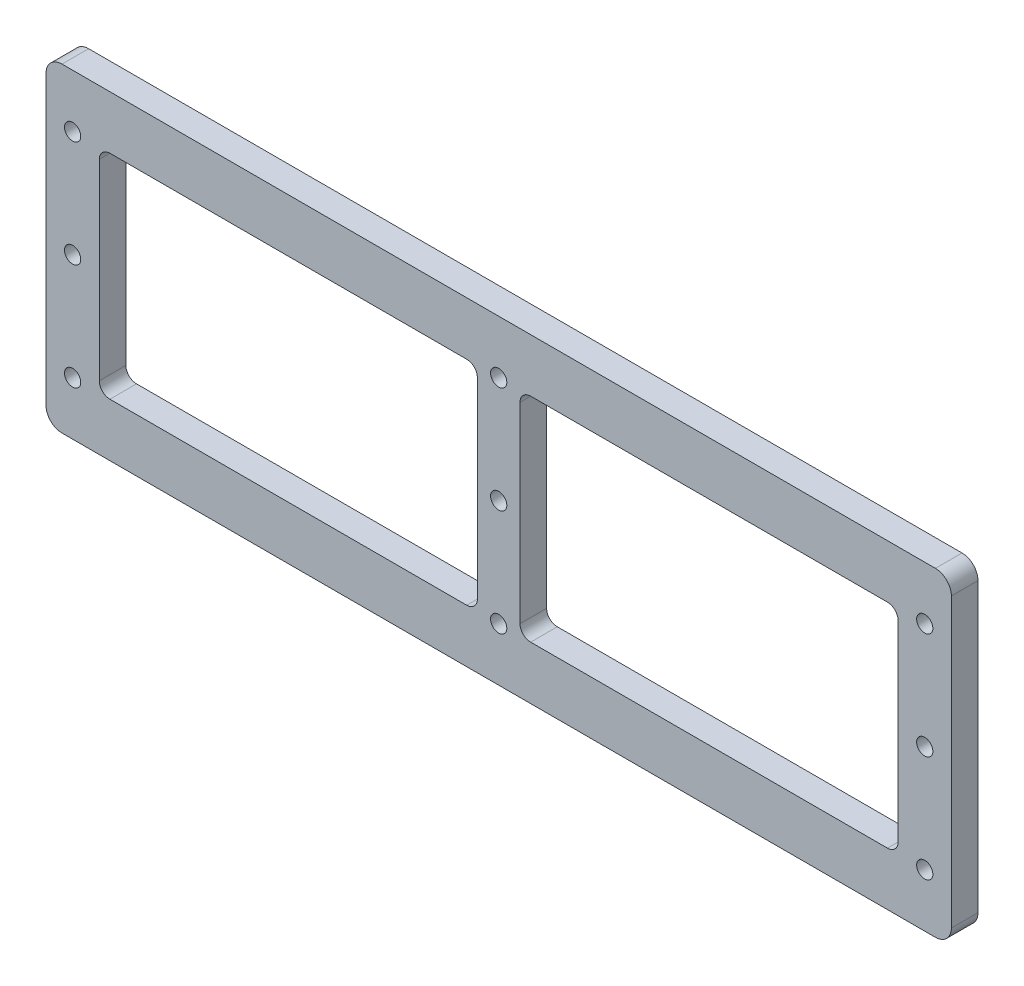
ISO-10303-21;
HEADER;
FILE_DESCRIPTION(('STEP AP214'),'2;1');
FILE_NAME('part.step','',(''),(''),'','','');
FILE_SCHEMA(('AUTOMOTIVE_DESIGN { 1 0 10303 214 1 1 1 1 }'));
ENDSEC;
DATA;
#1=APPLICATION_CONTEXT('core data for automotive mechanical design processes');
#2=APPLICATION_PROTOCOL_DEFINITION('international standard','automotive_design',2000,#1);
#3=PRODUCT_CONTEXT('',#1,'mechanical');
#4=PRODUCT('Part','Part','',(#3));
#5=PRODUCT_RELATED_PRODUCT_CATEGORY('part','',(#4));
#6=PRODUCT_DEFINITION_FORMATION('','',#4);
#7=PRODUCT_DEFINITION_CONTEXT('part definition',#1,'design');
#8=PRODUCT_DEFINITION('design','',#6,#7);
#9=PRODUCT_DEFINITION_SHAPE('','',#8);
#10=(LENGTH_UNIT() NAMED_UNIT(*) SI_UNIT(.MILLI.,.METRE.));
#11=(NAMED_UNIT(*) PLANE_ANGLE_UNIT() SI_UNIT($,.RADIAN.));
#12=(NAMED_UNIT(*) SI_UNIT($,.STERADIAN.) SOLID_ANGLE_UNIT());
#13=UNCERTAINTY_MEASURE_WITH_UNIT(LENGTH_MEASURE(1.E-05),#10,'distance_accuracy_value','');
#14=(GEOMETRIC_REPRESENTATION_CONTEXT(3) GLOBAL_UNCERTAINTY_ASSIGNED_CONTEXT((#13)) GLOBAL_UNIT_ASSIGNED_CONTEXT((#10,
#11,#12)) REPRESENTATION_CONTEXT('',''));
#15=CARTESIAN_POINT('',(0.,0.,0.));
#16=DIRECTION('',(0.,0.,1.));
#17=DIRECTION('',(1.,0.,0.));
#18=AXIS2_PLACEMENT_3D('',#15,#16,#17);
#19=CARTESIAN_POINT('',(-75.,-20.,0.));
#20=DIRECTION('',(0.,-1.,0.));
#21=DIRECTION('',(1.,0.,0.));
#22=AXIS2_PLACEMENT_3D('',#19,#20,#21);
#23=PLANE('',#22);
#24=DIRECTION('',(1.,0.,0.));
#25=VECTOR('',#24,1.);
#26=CARTESIAN_POINT('',(-75.,-20.,5.));
#27=LINE('',#26,#25);
#28=CARTESIAN_POINT('',(-73.,-20.,5.));
#29=VERTEX_POINT('',#28);
#30=CARTESIAN_POINT('',(-5.99999999999999,-20.,5.));
#31=VERTEX_POINT('',#30);
#32=EDGE_CURVE('E333',#29,#31,#27,.T.);
#33=ORIENTED_EDGE('',*,*,#32,.T.);
#34=DIRECTION('',(0.,0.,1.));
#35=VECTOR('',#34,1.);
#36=CARTESIAN_POINT('',(-5.99999999999999,-20.,0.));
#37=LINE('',#36,#35);
#38=CARTESIAN_POINT('',(-5.99999999999999,-20.,0.));
#39=VERTEX_POINT('',#38);
#40=EDGE_CURVE('E273',#31,#39,#37,.F.);
#41=ORIENTED_EDGE('',*,*,#40,.T.);
#42=DIRECTION('',(1.,0.,0.));
#43=VECTOR('',#42,1.);
#44=CARTESIAN_POINT('',(-75.,-20.,0.));
#45=LINE('',#44,#43);
#46=CARTESIAN_POINT('',(-73.,-20.,0.));
#47=VERTEX_POINT('',#46);
#48=EDGE_CURVE('E344',#47,#39,#45,.T.);
#49=ORIENTED_EDGE('',*,*,#48,.F.);
#50=DIRECTION('',(0.,0.,1.));
#51=VECTOR('',#50,1.);
#52=CARTESIAN_POINT('',(-73.,-20.,5.));
#53=LINE('',#52,#51);
#54=EDGE_CURVE('E270',#47,#29,#53,.T.);
#55=ORIENTED_EDGE('',*,*,#54,.T.);
#56=EDGE_LOOP('',(#33,#41,#49,#55));
#57=FACE_BOUND('',#56,.T.);
#58=ADVANCED_FACE('F35',(#57),#23,.F.);
#59=CARTESIAN_POINT('',(-75.,20.,0.));
#60=DIRECTION('',(0.,1.,0.));
#61=DIRECTION('',(-1.,0.,0.));
#62=AXIS2_PLACEMENT_3D('',#59,#60,#61);
#63=PLANE('',#62);
#64=DIRECTION('',(-1.,0.,0.));
#65=VECTOR('',#64,1.);
#66=CARTESIAN_POINT('',(-75.,20.,0.));
#67=LINE('',#66,#65);
#68=CARTESIAN_POINT('',(-6.00000000000001,20.,0.));
#69=VERTEX_POINT('',#68);
#70=CARTESIAN_POINT('',(-73.,20.,0.));
#71=VERTEX_POINT('',#70);
#72=EDGE_CURVE('E445',#69,#71,#67,.T.);
#73=ORIENTED_EDGE('',*,*,#72,.F.);
#74=DIRECTION('',(0.,0.,1.));
#75=VECTOR('',#74,1.);
#76=CARTESIAN_POINT('',(-6.00000000000001,20.,0.));
#77=LINE('',#76,#75);
#78=CARTESIAN_POINT('',(-6.00000000000001,20.,5.));
#79=VERTEX_POINT('',#78);
#80=EDGE_CURVE('E262',#69,#79,#77,.T.);
#81=ORIENTED_EDGE('',*,*,#80,.T.);
#82=DIRECTION('',(-1.,0.,0.));
#83=VECTOR('',#82,1.);
#84=CARTESIAN_POINT('',(-75.,20.,5.));
#85=LINE('',#84,#83);
#86=CARTESIAN_POINT('',(-73.,20.,5.));
#87=VERTEX_POINT('',#86);
#88=EDGE_CURVE('E359',#79,#87,#85,.T.);
#89=ORIENTED_EDGE('',*,*,#88,.T.);
#90=DIRECTION('',(0.,0.,1.));
#91=VECTOR('',#90,1.);
#92=CARTESIAN_POINT('',(-73.,20.,0.));
#93=LINE('',#92,#91);
#94=EDGE_CURVE('E260',#87,#71,#93,.F.);
#95=ORIENTED_EDGE('',*,*,#94,.T.);
#96=EDGE_LOOP('',(#73,#81,#89,#95));
#97=FACE_BOUND('',#96,.T.);
#98=ADVANCED_FACE('F408',(#97),#63,.F.);
#99=CARTESIAN_POINT('',(85.,-30.,5.));
#100=DIRECTION('',(-1.,0.,0.));
#101=DIRECTION('',(0.,0.,1.));
#102=AXIS2_PLACEMENT_3D('',#99,#100,#101);
#103=PLANE('',#102);
#104=DIRECTION('',(0.,1.,0.));
#105=VECTOR('',#104,1.);
#106=CARTESIAN_POINT('',(85.,-30.,5.));
#107=LINE('',#106,#105);
#108=CARTESIAN_POINT('',(85.,-27.,5.));
#109=VERTEX_POINT('',#108);
#110=CARTESIAN_POINT('',(85.,27.,5.));
#111=VERTEX_POINT('',#110);
#112=EDGE_CURVE('E227',#109,#111,#107,.T.);
#113=ORIENTED_EDGE('',*,*,#112,.F.);
#114=DIRECTION('',(0.,0.,-1.));
#115=VECTOR('',#114,1.);
#116=CARTESIAN_POINT('',(85.,-27.,5.));
#117=LINE('',#116,#115);
#118=CARTESIAN_POINT('',(85.,-27.,0.));
#119=VERTEX_POINT('',#118);
#120=EDGE_CURVE('E257',#109,#119,#117,.T.);
#121=ORIENTED_EDGE('',*,*,#120,.T.);
#122=DIRECTION('',(0.,1.,0.));
#123=VECTOR('',#122,1.);
#124=CARTESIAN_POINT('',(85.,-30.,0.));
#125=LINE('',#124,#123);
#126=CARTESIAN_POINT('',(85.,27.,0.));
#127=VERTEX_POINT('',#126);
#128=EDGE_CURVE('E229',#119,#127,#125,.T.);
#129=ORIENTED_EDGE('',*,*,#128,.T.);
#130=DIRECTION('',(0.,0.,-1.));
#131=VECTOR('',#130,1.);
#132=CARTESIAN_POINT('',(85.,27.,5.));
#133=LINE('',#132,#131);
#134=EDGE_CURVE('E255',#127,#111,#133,.F.);
#135=ORIENTED_EDGE('',*,*,#134,.T.);
#136=EDGE_LOOP('',(#113,#121,#129,#135));
#137=FACE_BOUND('',#136,.T.);
#138=ADVANCED_FACE('F384',(#137),#103,.F.);
#139=CARTESIAN_POINT('',(-85.,30.,5.));
#140=DIRECTION('',(0.,-1.,0.));
#141=DIRECTION('',(0.,0.,-1.));
#142=AXIS2_PLACEMENT_3D('',#139,#140,#141);
#143=PLANE('',#142);
#144=DIRECTION('',(-1.,0.,0.));
#145=VECTOR('',#144,1.);
#146=CARTESIAN_POINT('',(-85.,30.,0.));
#147=LINE('',#146,#145);
#148=CARTESIAN_POINT('',(82.,30.,0.));
#149=VERTEX_POINT('',#148);
#150=CARTESIAN_POINT('',(-82.,30.,0.));
#151=VERTEX_POINT('',#150);
#152=EDGE_CURVE('E224',#149,#151,#147,.T.);
#153=ORIENTED_EDGE('',*,*,#152,.T.);
#154=DIRECTION('',(0.,0.,-1.));
#155=VECTOR('',#154,1.);
#156=CARTESIAN_POINT('',(-82.,30.,5.));
#157=LINE('',#156,#155);
#158=CARTESIAN_POINT('',(-82.,30.,5.));
#159=VERTEX_POINT('',#158);
#160=EDGE_CURVE('E202',#151,#159,#157,.F.);
#161=ORIENTED_EDGE('',*,*,#160,.T.);
#162=DIRECTION('',(-1.,0.,0.));
#163=VECTOR('',#162,1.);
#164=CARTESIAN_POINT('',(-85.,30.,5.));
#165=LINE('',#164,#163);
#166=CARTESIAN_POINT('',(82.,30.,5.));
#167=VERTEX_POINT('',#166);
#168=EDGE_CURVE('E367',#167,#159,#165,.T.);
#169=ORIENTED_EDGE('',*,*,#168,.F.);
#170=DIRECTION('',(0.,0.,-1.));
#171=VECTOR('',#170,1.);
#172=CARTESIAN_POINT('',(82.,30.,5.));
#173=LINE('',#172,#171);
#174=EDGE_CURVE('E207',#167,#149,#173,.T.);
#175=ORIENTED_EDGE('',*,*,#174,.T.);
#176=EDGE_LOOP('',(#153,#161,#169,#175));
#177=FACE_BOUND('',#176,.T.);
#178=ADVANCED_FACE('F392',(#177),#143,.F.);
#179=CARTESIAN_POINT('',(-85.,-30.,5.));
#180=DIRECTION('',(1.,0.,0.));
#181=DIRECTION('',(0.,0.,-1.));
#182=AXIS2_PLACEMENT_3D('',#179,#180,#181);
#183=PLANE('',#182);
#184=DIRECTION('',(0.,-1.,0.));
#185=VECTOR('',#184,1.);
#186=CARTESIAN_POINT('',(-85.,-30.,5.));
#187=LINE('',#186,#185);
#188=CARTESIAN_POINT('',(-85.,27.,5.));
#189=VERTEX_POINT('',#188);
#190=CARTESIAN_POINT('',(-85.,-27.,5.));
#191=VERTEX_POINT('',#190);
#192=EDGE_CURVE('E217',#189,#191,#187,.T.);
#193=ORIENTED_EDGE('',*,*,#192,.F.);
#194=DIRECTION('',(0.,0.,-1.));
#195=VECTOR('',#194,1.);
#196=CARTESIAN_POINT('',(-85.,27.,5.));
#197=LINE('',#196,#195);
#198=CARTESIAN_POINT('',(-85.,27.,0.));
#199=VERTEX_POINT('',#198);
#200=EDGE_CURVE('E201',#189,#199,#197,.T.);
#201=ORIENTED_EDGE('',*,*,#200,.T.);
#202=DIRECTION('',(0.,-1.,0.));
#203=VECTOR('',#202,1.);
#204=CARTESIAN_POINT('',(-85.,-30.,0.));
#205=LINE('',#204,#203);
#206=CARTESIAN_POINT('',(-85.,-27.,0.));
#207=VERTEX_POINT('',#206);
#208=EDGE_CURVE('E214',#199,#207,#205,.T.);
#209=ORIENTED_EDGE('',*,*,#208,.T.);
#210=DIRECTION('',(0.,0.,-1.));
#211=VECTOR('',#210,1.);
#212=CARTESIAN_POINT('',(-85.,-27.,5.));
#213=LINE('',#212,#211);
#214=EDGE_CURVE('E219',#207,#191,#213,.F.);
#215=ORIENTED_EDGE('',*,*,#214,.T.);
#216=EDGE_LOOP('',(#193,#201,#209,#215));
#217=FACE_BOUND('',#216,.T.);
#218=ADVANCED_FACE('F213',(#217),#183,.F.);
#219=CARTESIAN_POINT('',(-85.,-30.,5.));
#220=DIRECTION('',(0.,1.,0.));
#221=DIRECTION('',(0.,0.,1.));
#222=AXIS2_PLACEMENT_3D('',#219,#220,#221);
#223=PLANE('',#222);
#224=DIRECTION('',(1.,0.,0.));
#225=VECTOR('',#224,1.);
#226=CARTESIAN_POINT('',(-85.,-30.,5.));
#227=LINE('',#226,#225);
#228=CARTESIAN_POINT('',(-82.,-30.,5.));
#229=VERTEX_POINT('',#228);
#230=CARTESIAN_POINT('',(82.,-30.,5.));
#231=VERTEX_POINT('',#230);
#232=EDGE_CURVE('E233',#229,#231,#227,.T.);
#233=ORIENTED_EDGE('',*,*,#232,.F.);
#234=DIRECTION('',(0.,0.,-1.));
#235=VECTOR('',#234,1.);
#236=CARTESIAN_POINT('',(-82.,-30.,5.));
#237=LINE('',#236,#235);
#238=CARTESIAN_POINT('',(-82.,-30.,0.));
#239=VERTEX_POINT('',#238);
#240=EDGE_CURVE('E252',#229,#239,#237,.T.);
#241=ORIENTED_EDGE('',*,*,#240,.T.);
#242=DIRECTION('',(1.,0.,0.));
#243=VECTOR('',#242,1.);
#244=CARTESIAN_POINT('',(-85.,-30.,0.));
#245=LINE('',#244,#243);
#246=CARTESIAN_POINT('',(82.,-30.,0.));
#247=VERTEX_POINT('',#246);
#248=EDGE_CURVE('E223',#239,#247,#245,.T.);
#249=ORIENTED_EDGE('',*,*,#248,.T.);
#250=DIRECTION('',(0.,0.,-1.));
#251=VECTOR('',#250,1.);
#252=CARTESIAN_POINT('',(82.,-30.,5.));
#253=LINE('',#252,#251);
#254=EDGE_CURVE('E250',#247,#231,#253,.F.);
#255=ORIENTED_EDGE('',*,*,#254,.T.);
#256=EDGE_LOOP('',(#233,#241,#249,#255));
#257=FACE_BOUND('',#256,.T.);
#258=ADVANCED_FACE('F395',(#257),#223,.F.);
#259=CARTESIAN_POINT('',(0.,0.,5.));
#260=DIRECTION('',(0.,0.,-1.));
#261=DIRECTION('',(-1.,0.,0.));
#262=AXIS2_PLACEMENT_3D('',#259,#260,#261);
#263=PLANE('',#262);
#264=CARTESIAN_POINT('',(-80.,0.,5.));
#265=DIRECTION('',(0.,0.,-1.));
#266=DIRECTION('',(-1.,0.,0.));
#267=AXIS2_PLACEMENT_3D('',#264,#265,#266);
#268=CIRCLE('',#267,1.525);
#269=CARTESIAN_POINT('',(-81.525,0.,5.));
#270=VERTEX_POINT('',#269);
#271=EDGE_CURVE('E700',#270,#270,#268,.F.);
#272=ORIENTED_EDGE('',*,*,#271,.F.);
#273=EDGE_LOOP('',(#272));
#274=FACE_BOUND('',#273,.T.);
#275=CARTESIAN_POINT('',(0.,-20.,5.));
#276=DIRECTION('',(0.,0.,-1.));
#277=DIRECTION('',(-1.,0.,0.));
#278=AXIS2_PLACEMENT_3D('',#275,#276,#277);
#279=CIRCLE('',#278,1.525);
#280=CARTESIAN_POINT('',(-1.525,-20.,5.));
#281=VERTEX_POINT('',#280);
#282=EDGE_CURVE('E701',#281,#281,#279,.F.);
#283=ORIENTED_EDGE('',*,*,#282,.F.);
#284=EDGE_LOOP('',(#283));
#285=FACE_BOUND('',#284,.T.);
#286=CARTESIAN_POINT('',(0.,20.,5.));
#287=DIRECTION('',(0.,0.,-1.));
#288=DIRECTION('',(-1.,0.,0.));
#289=AXIS2_PLACEMENT_3D('',#286,#287,#288);
#290=CIRCLE('',#289,1.525);
#291=CARTESIAN_POINT('',(-1.525,20.,5.));
#292=VERTEX_POINT('',#291);
#293=EDGE_CURVE('E707',#292,#292,#290,.F.);
#294=ORIENTED_EDGE('',*,*,#293,.F.);
#295=EDGE_LOOP('',(#294));
#296=FACE_BOUND('',#295,.T.);
#297=CARTESIAN_POINT('',(80.,20.,5.));
#298=DIRECTION('',(0.,0.,-1.));
#299=DIRECTION('',(-1.,0.,0.));
#300=AXIS2_PLACEMENT_3D('',#297,#298,#299);
#301=CIRCLE('',#300,1.525);
#302=CARTESIAN_POINT('',(78.475,20.,5.));
#303=VERTEX_POINT('',#302);
#304=EDGE_CURVE('E713',#303,#303,#301,.F.);
#305=ORIENTED_EDGE('',*,*,#304,.F.);
#306=EDGE_LOOP('',(#305));
#307=FACE_BOUND('',#306,.T.);
#308=CARTESIAN_POINT('',(80.,0.,5.));
#309=DIRECTION('',(0.,0.,-1.));
#310=DIRECTION('',(-1.,0.,0.));
#311=AXIS2_PLACEMENT_3D('',#308,#309,#310);
#312=CIRCLE('',#311,1.525);
#313=CARTESIAN_POINT('',(78.475,0.,5.));
#314=VERTEX_POINT('',#313);
#315=EDGE_CURVE('E670',#314,#314,#312,.F.);
#316=ORIENTED_EDGE('',*,*,#315,.F.);
#317=EDGE_LOOP('',(#316));
#318=FACE_BOUND('',#317,.T.);
#319=CARTESIAN_POINT('',(80.,-20.,5.));
#320=DIRECTION('',(0.,0.,-1.));
#321=DIRECTION('',(-1.,0.,0.));
#322=AXIS2_PLACEMENT_3D('',#319,#320,#321);
#323=CIRCLE('',#322,1.525);
#324=CARTESIAN_POINT('',(78.475,-20.,5.));
#325=VERTEX_POINT('',#324);
#326=EDGE_CURVE('E675',#325,#325,#323,.F.);
#327=ORIENTED_EDGE('',*,*,#326,.F.);
#328=EDGE_LOOP('',(#327));
#329=FACE_BOUND('',#328,.T.);
#330=CARTESIAN_POINT('',(0.,0.,5.));
#331=DIRECTION('',(0.,0.,-1.));
#332=DIRECTION('',(-1.,0.,0.));
#333=AXIS2_PLACEMENT_3D('',#330,#331,#332);
#334=CIRCLE('',#333,1.525);
#335=CARTESIAN_POINT('',(-1.525,0.,5.));
#336=VERTEX_POINT('',#335);
#337=EDGE_CURVE('E684',#336,#336,#334,.F.);
#338=ORIENTED_EDGE('',*,*,#337,.F.);
#339=EDGE_LOOP('',(#338));
#340=FACE_BOUND('',#339,.T.);
#341=CARTESIAN_POINT('',(-80.,-20.,5.));
#342=DIRECTION('',(0.,0.,-1.));
#343=DIRECTION('',(-1.,0.,0.));
#344=AXIS2_PLACEMENT_3D('',#341,#342,#343);
#345=CIRCLE('',#344,1.525);
#346=CARTESIAN_POINT('',(-81.525,-20.,5.));
#347=VERTEX_POINT('',#346);
#348=EDGE_CURVE('E689',#347,#347,#345,.F.);
#349=ORIENTED_EDGE('',*,*,#348,.F.);
#350=EDGE_LOOP('',(#349));
#351=FACE_BOUND('',#350,.T.);
#352=CARTESIAN_POINT('',(-80.,20.,5.));
#353=DIRECTION('',(0.,0.,-1.));
#354=DIRECTION('',(-1.,0.,0.));
#355=AXIS2_PLACEMENT_3D('',#352,#353,#354);
#356=CIRCLE('',#355,1.525);
#357=CARTESIAN_POINT('',(-81.525,20.,5.));
#358=VERTEX_POINT('',#357);
#359=EDGE_CURVE('E469',#358,#358,#356,.F.);
#360=ORIENTED_EDGE('',*,*,#359,.F.);
#361=EDGE_LOOP('',(#360));
#362=FACE_BOUND('',#361,.T.);
#363=CARTESIAN_POINT('',(6.00000000000001,-20.,5.));
#364=VERTEX_POINT('',#363);
#365=CARTESIAN_POINT('',(73.,-20.,5.));
#366=VERTEX_POINT('',#365);
#367=EDGE_CURVE('E338',#364,#366,#27,.T.);
#368=ORIENTED_EDGE('',*,*,#367,.F.);
#369=CARTESIAN_POINT('',(6.00000000000001,-18.,5.));
#370=DIRECTION('',(0.,0.,-1.));
#371=DIRECTION('',(-1.,0.,0.));
#372=AXIS2_PLACEMENT_3D('',#369,#370,#371);
#373=CIRCLE('',#372,2.);
#374=CARTESIAN_POINT('',(4.,-18.,5.));
#375=VERTEX_POINT('',#374);
#376=EDGE_CURVE('E319',#364,#375,#373,.T.);
#377=ORIENTED_EDGE('',*,*,#376,.T.);
#378=DIRECTION('',(0.,1.,0.));
#379=VECTOR('',#378,1.);
#380=CARTESIAN_POINT('',(4.,-20.,5.));
#381=LINE('',#380,#379);
#382=CARTESIAN_POINT('',(4.,18.,5.));
#383=VERTEX_POINT('',#382);
#384=EDGE_CURVE('E465',#375,#383,#381,.T.);
#385=ORIENTED_EDGE('',*,*,#384,.T.);
#386=CARTESIAN_POINT('',(6.,18.,5.));
#387=DIRECTION('',(0.,0.,-1.));
#388=DIRECTION('',(-1.,0.,0.));
#389=AXIS2_PLACEMENT_3D('',#386,#387,#388);
#390=CIRCLE('',#389,2.);
#391=CARTESIAN_POINT('',(6.00000000000001,20.,5.));
#392=VERTEX_POINT('',#391);
#393=EDGE_CURVE('E307',#383,#392,#390,.T.);
#394=ORIENTED_EDGE('',*,*,#393,.T.);
#395=CARTESIAN_POINT('',(73.,20.,5.));
#396=VERTEX_POINT('',#395);
#397=EDGE_CURVE('E339',#396,#392,#85,.T.);
#398=ORIENTED_EDGE('',*,*,#397,.F.);
#399=CARTESIAN_POINT('',(73.,18.,5.));
#400=DIRECTION('',(0.,0.,-1.));
#401=DIRECTION('',(-1.,0.,0.));
#402=AXIS2_PLACEMENT_3D('',#399,#400,#401);
#403=CIRCLE('',#402,2.);
#404=CARTESIAN_POINT('',(75.,18.,5.));
#405=VERTEX_POINT('',#404);
#406=EDGE_CURVE('E311',#396,#405,#403,.T.);
#407=ORIENTED_EDGE('',*,*,#406,.T.);
#408=DIRECTION('',(0.,1.,0.));
#409=VECTOR('',#408,1.);
#410=CARTESIAN_POINT('',(75.,-20.,5.));
#411=LINE('',#410,#409);
#412=CARTESIAN_POINT('',(75.,-18.,5.));
#413=VERTEX_POINT('',#412);
#414=EDGE_CURVE('E356',#413,#405,#411,.T.);
#415=ORIENTED_EDGE('',*,*,#414,.F.);
#416=CARTESIAN_POINT('',(73.,-18.,5.));
#417=DIRECTION('',(0.,0.,-1.));
#418=DIRECTION('',(-1.,0.,0.));
#419=AXIS2_PLACEMENT_3D('',#416,#417,#418);
#420=CIRCLE('',#419,2.);
#421=EDGE_CURVE('E315',#413,#366,#420,.T.);
#422=ORIENTED_EDGE('',*,*,#421,.T.);
#423=EDGE_LOOP('',(#368,#377,#385,#394,#398,#407,#415,#422));
#424=FACE_BOUND('',#423,.T.);
#425=ORIENTED_EDGE('',*,*,#88,.F.);
#426=CARTESIAN_POINT('',(-6.00000000000001,18.,5.));
#427=DIRECTION('',(0.,0.,-1.));
#428=DIRECTION('',(-1.,0.,0.));
#429=AXIS2_PLACEMENT_3D('',#426,#427,#428);
#430=CIRCLE('',#429,2.);
#431=CARTESIAN_POINT('',(-4.,18.,5.));
#432=VERTEX_POINT('',#431);
#433=EDGE_CURVE('E299',#79,#432,#430,.T.);
#434=ORIENTED_EDGE('',*,*,#433,.T.);
#435=DIRECTION('',(0.,-1.,0.));
#436=VECTOR('',#435,1.);
#437=CARTESIAN_POINT('',(-3.99999999999999,-20.,5.));
#438=LINE('',#437,#436);
#439=CARTESIAN_POINT('',(-3.99999999999999,-18.,5.));
#440=VERTEX_POINT('',#439);
#441=EDGE_CURVE('E468',#432,#440,#438,.T.);
#442=ORIENTED_EDGE('',*,*,#441,.T.);
#443=CARTESIAN_POINT('',(-5.99999999999999,-18.,5.));
#444=DIRECTION('',(0.,0.,-1.));
#445=DIRECTION('',(-1.,0.,0.));
#446=AXIS2_PLACEMENT_3D('',#443,#444,#445);
#447=CIRCLE('',#446,2.);
#448=EDGE_CURVE('E303',#440,#31,#447,.T.);
#449=ORIENTED_EDGE('',*,*,#448,.T.);
#450=ORIENTED_EDGE('',*,*,#32,.F.);
#451=CARTESIAN_POINT('',(-73.,-18.,5.));
#452=DIRECTION('',(0.,0.,-1.));
#453=DIRECTION('',(-1.,0.,0.));
#454=AXIS2_PLACEMENT_3D('',#451,#452,#453);
#455=CIRCLE('',#454,2.);
#456=CARTESIAN_POINT('',(-75.,-18.,5.));
#457=VERTEX_POINT('',#456);
#458=EDGE_CURVE('E43',#29,#457,#455,.T.);
#459=ORIENTED_EDGE('',*,*,#458,.T.);
#460=DIRECTION('',(0.,-1.,0.));
#461=VECTOR('',#460,1.);
#462=CARTESIAN_POINT('',(-75.,-20.,5.));
#463=LINE('',#462,#461);
#464=CARTESIAN_POINT('',(-75.,18.,5.));
#465=VERTEX_POINT('',#464);
#466=EDGE_CURVE('E331',#465,#457,#463,.T.);
#467=ORIENTED_EDGE('',*,*,#466,.F.);
#468=CARTESIAN_POINT('',(-73.,18.,5.));
#469=DIRECTION('',(0.,0.,-1.));
#470=DIRECTION('',(-1.,0.,0.));
#471=AXIS2_PLACEMENT_3D('',#468,#469,#470);
#472=CIRCLE('',#471,2.);
#473=EDGE_CURVE('E323',#465,#87,#472,.T.);
#474=ORIENTED_EDGE('',*,*,#473,.T.);
#475=EDGE_LOOP('',(#425,#434,#442,#449,#450,#459,#467,#474));
#476=FACE_BOUND('',#475,.T.);
#477=ORIENTED_EDGE('',*,*,#168,.T.);
#478=CARTESIAN_POINT('',(-82.,27.,5.));
#479=DIRECTION('',(0.,0.,-1.));
#480=DIRECTION('',(-1.,0.,0.));
#481=AXIS2_PLACEMENT_3D('',#478,#479,#480);
#482=CIRCLE('',#481,3.);
#483=EDGE_CURVE('E248',#159,#189,#482,.F.);
#484=ORIENTED_EDGE('',*,*,#483,.T.);
#485=ORIENTED_EDGE('',*,*,#192,.T.);
#486=CARTESIAN_POINT('',(-82.,-27.,5.));
#487=DIRECTION('',(0.,0.,-1.));
#488=DIRECTION('',(-1.,0.,0.));
#489=AXIS2_PLACEMENT_3D('',#486,#487,#488);
#490=CIRCLE('',#489,3.);
#491=EDGE_CURVE('E246',#191,#229,#490,.F.);
#492=ORIENTED_EDGE('',*,*,#491,.T.);
#493=ORIENTED_EDGE('',*,*,#232,.T.);
#494=CARTESIAN_POINT('',(82.,-27.,5.));
#495=DIRECTION('',(0.,0.,-1.));
#496=DIRECTION('',(-1.,0.,0.));
#497=AXIS2_PLACEMENT_3D('',#494,#495,#496);
#498=CIRCLE('',#497,3.);
#499=EDGE_CURVE('E244',#231,#109,#498,.F.);
#500=ORIENTED_EDGE('',*,*,#499,.T.);
#501=ORIENTED_EDGE('',*,*,#112,.T.);
#502=CARTESIAN_POINT('',(82.,27.,5.));
#503=DIRECTION('',(0.,0.,-1.));
#504=DIRECTION('',(-1.,0.,0.));
#505=AXIS2_PLACEMENT_3D('',#502,#503,#504);
#506=CIRCLE('',#505,3.);
#507=EDGE_CURVE('E242',#111,#167,#506,.F.);
#508=ORIENTED_EDGE('',*,*,#507,.T.);
#509=EDGE_LOOP('',(#477,#484,#485,#492,#493,#500,#501,#508));
#510=FACE_BOUND('',#509,.T.);
#511=ADVANCED_FACE('F329',(#274,#285,#296,#307,#318,#329,#340,#351,#362,#424,#476,#510),#263,.F.);
#512=CARTESIAN_POINT('',(0.,0.,0.));
#513=DIRECTION('',(0.,0.,-1.));
#514=DIRECTION('',(-1.,0.,0.));
#515=AXIS2_PLACEMENT_3D('',#512,#513,#514);
#516=PLANE('',#515);
#517=CARTESIAN_POINT('',(-80.,0.,0.));
#518=DIRECTION('',(0.,0.,-1.));
#519=DIRECTION('',(-1.,0.,0.));
#520=AXIS2_PLACEMENT_3D('',#517,#518,#519);
#521=CIRCLE('',#520,1.525);
#522=CARTESIAN_POINT('',(-81.525,0.,0.));
#523=VERTEX_POINT('',#522);
#524=EDGE_CURVE('E697',#523,#523,#521,.T.);
#525=ORIENTED_EDGE('',*,*,#524,.F.);
#526=EDGE_LOOP('',(#525));
#527=FACE_BOUND('',#526,.T.);
#528=CARTESIAN_POINT('',(0.,-20.,0.));
#529=DIRECTION('',(0.,0.,-1.));
#530=DIRECTION('',(-1.,0.,0.));
#531=AXIS2_PLACEMENT_3D('',#528,#529,#530);
#532=CIRCLE('',#531,1.525);
#533=CARTESIAN_POINT('',(-1.525,-20.,0.));
#534=VERTEX_POINT('',#533);
#535=EDGE_CURVE('E704',#534,#534,#532,.T.);
#536=ORIENTED_EDGE('',*,*,#535,.F.);
#537=EDGE_LOOP('',(#536));
#538=FACE_BOUND('',#537,.T.);
#539=CARTESIAN_POINT('',(0.,20.,0.));
#540=DIRECTION('',(0.,0.,-1.));
#541=DIRECTION('',(-1.,0.,0.));
#542=AXIS2_PLACEMENT_3D('',#539,#540,#541);
#543=CIRCLE('',#542,1.525);
#544=CARTESIAN_POINT('',(-1.525,20.,0.));
#545=VERTEX_POINT('',#544);
#546=EDGE_CURVE('E710',#545,#545,#543,.T.);
#547=ORIENTED_EDGE('',*,*,#546,.F.);
#548=EDGE_LOOP('',(#547));
#549=FACE_BOUND('',#548,.T.);
#550=CARTESIAN_POINT('',(80.,20.,0.));
#551=DIRECTION('',(0.,0.,-1.));
#552=DIRECTION('',(-1.,0.,0.));
#553=AXIS2_PLACEMENT_3D('',#550,#551,#552);
#554=CIRCLE('',#553,1.525);
#555=CARTESIAN_POINT('',(78.475,20.,0.));
#556=VERTEX_POINT('',#555);
#557=EDGE_CURVE('E677',#556,#556,#554,.T.);
#558=ORIENTED_EDGE('',*,*,#557,.F.);
#559=EDGE_LOOP('',(#558));
#560=FACE_BOUND('',#559,.T.);
#561=CARTESIAN_POINT('',(80.,0.,0.));
#562=DIRECTION('',(0.,0.,-1.));
#563=DIRECTION('',(-1.,0.,0.));
#564=AXIS2_PLACEMENT_3D('',#561,#562,#563);
#565=CIRCLE('',#564,1.525);
#566=CARTESIAN_POINT('',(78.475,0.,0.));
#567=VERTEX_POINT('',#566);
#568=EDGE_CURVE('E673',#567,#567,#565,.T.);
#569=ORIENTED_EDGE('',*,*,#568,.F.);
#570=EDGE_LOOP('',(#569));
#571=FACE_BOUND('',#570,.T.);
#572=CARTESIAN_POINT('',(80.,-20.,0.));
#573=DIRECTION('',(0.,0.,-1.));
#574=DIRECTION('',(-1.,0.,0.));
#575=AXIS2_PLACEMENT_3D('',#572,#573,#574);
#576=CIRCLE('',#575,1.525);
#577=CARTESIAN_POINT('',(78.475,-20.,0.));
#578=VERTEX_POINT('',#577);
#579=EDGE_CURVE('E680',#578,#578,#576,.T.);
#580=ORIENTED_EDGE('',*,*,#579,.F.);
#581=EDGE_LOOP('',(#580));
#582=FACE_BOUND('',#581,.T.);
#583=CARTESIAN_POINT('',(0.,0.,0.));
#584=DIRECTION('',(0.,0.,-1.));
#585=DIRECTION('',(-1.,0.,0.));
#586=AXIS2_PLACEMENT_3D('',#583,#584,#585);
#587=CIRCLE('',#586,1.525);
#588=CARTESIAN_POINT('',(-1.525,0.,0.));
#589=VERTEX_POINT('',#588);
#590=EDGE_CURVE('E686',#589,#589,#587,.T.);
#591=ORIENTED_EDGE('',*,*,#590,.F.);
#592=EDGE_LOOP('',(#591));
#593=FACE_BOUND('',#592,.T.);
#594=CARTESIAN_POINT('',(-80.,-20.,0.));
#595=DIRECTION('',(0.,0.,-1.));
#596=DIRECTION('',(-1.,0.,0.));
#597=AXIS2_PLACEMENT_3D('',#594,#595,#596);
#598=CIRCLE('',#597,1.525);
#599=CARTESIAN_POINT('',(-81.525,-20.,0.));
#600=VERTEX_POINT('',#599);
#601=EDGE_CURVE('E692',#600,#600,#598,.T.);
#602=ORIENTED_EDGE('',*,*,#601,.F.);
#603=EDGE_LOOP('',(#602));
#604=FACE_BOUND('',#603,.T.);
#605=CARTESIAN_POINT('',(-80.,20.,0.));
#606=DIRECTION('',(0.,0.,-1.));
#607=DIRECTION('',(-1.,0.,0.));
#608=AXIS2_PLACEMENT_3D('',#605,#606,#607);
#609=CIRCLE('',#608,1.525);
#610=CARTESIAN_POINT('',(-81.525,20.,0.));
#611=VERTEX_POINT('',#610);
#612=EDGE_CURVE('E474',#611,#611,#609,.T.);
#613=ORIENTED_EDGE('',*,*,#612,.F.);
#614=EDGE_LOOP('',(#613));
#615=FACE_BOUND('',#614,.T.);
#616=DIRECTION('',(0.,1.,0.));
#617=VECTOR('',#616,1.);
#618=CARTESIAN_POINT('',(4.,-20.,0.));
#619=LINE('',#618,#617);
#620=CARTESIAN_POINT('',(4.,-18.,0.));
#621=VERTEX_POINT('',#620);
#622=CARTESIAN_POINT('',(4.,18.,0.));
#623=VERTEX_POINT('',#622);
#624=EDGE_CURVE('E360',#621,#623,#619,.T.);
#625=ORIENTED_EDGE('',*,*,#624,.F.);
#626=CARTESIAN_POINT('',(6.00000000000001,-18.,0.));
#627=DIRECTION('',(0.,0.,-1.));
#628=DIRECTION('',(-1.,0.,0.));
#629=AXIS2_PLACEMENT_3D('',#626,#627,#628);
#630=CIRCLE('',#629,2.);
#631=CARTESIAN_POINT('',(6.00000000000001,-20.,0.));
#632=VERTEX_POINT('',#631);
#633=EDGE_CURVE('E321',#621,#632,#630,.F.);
#634=ORIENTED_EDGE('',*,*,#633,.T.);
#635=CARTESIAN_POINT('',(73.,-20.,0.));
#636=VERTEX_POINT('',#635);
#637=EDGE_CURVE('E349',#632,#636,#45,.T.);
#638=ORIENTED_EDGE('',*,*,#637,.T.);
#639=CARTESIAN_POINT('',(73.,-18.,0.));
#640=DIRECTION('',(0.,0.,-1.));
#641=DIRECTION('',(-1.,0.,0.));
#642=AXIS2_PLACEMENT_3D('',#639,#640,#641);
#643=CIRCLE('',#642,2.);
#644=CARTESIAN_POINT('',(75.,-18.,0.));
#645=VERTEX_POINT('',#644);
#646=EDGE_CURVE('E317',#636,#645,#643,.F.);
#647=ORIENTED_EDGE('',*,*,#646,.T.);
#648=DIRECTION('',(0.,1.,0.));
#649=VECTOR('',#648,1.);
#650=CARTESIAN_POINT('',(75.,-20.,0.));
#651=LINE('',#650,#649);
#652=CARTESIAN_POINT('',(75.,18.,0.));
#653=VERTEX_POINT('',#652);
#654=EDGE_CURVE('E441',#645,#653,#651,.T.);
#655=ORIENTED_EDGE('',*,*,#654,.T.);
#656=CARTESIAN_POINT('',(73.,18.,0.));
#657=DIRECTION('',(0.,0.,-1.));
#658=DIRECTION('',(-1.,0.,0.));
#659=AXIS2_PLACEMENT_3D('',#656,#657,#658);
#660=CIRCLE('',#659,2.);
#661=CARTESIAN_POINT('',(73.,20.,0.));
#662=VERTEX_POINT('',#661);
#663=EDGE_CURVE('E313',#653,#662,#660,.F.);
#664=ORIENTED_EDGE('',*,*,#663,.T.);
#665=CARTESIAN_POINT('',(6.00000000000001,20.,0.));
#666=VERTEX_POINT('',#665);
#667=EDGE_CURVE('E447',#662,#666,#67,.T.);
#668=ORIENTED_EDGE('',*,*,#667,.T.);
#669=CARTESIAN_POINT('',(6.,18.,0.));
#670=DIRECTION('',(0.,0.,-1.));
#671=DIRECTION('',(-1.,0.,0.));
#672=AXIS2_PLACEMENT_3D('',#669,#670,#671);
#673=CIRCLE('',#672,2.);
#674=EDGE_CURVE('E309',#666,#623,#673,.F.);
#675=ORIENTED_EDGE('',*,*,#674,.T.);
#676=EDGE_LOOP('',(#625,#634,#638,#647,#655,#664,#668,#675));
#677=FACE_BOUND('',#676,.T.);
#678=DIRECTION('',(0.,-1.,0.));
#679=VECTOR('',#678,1.);
#680=CARTESIAN_POINT('',(-75.,-20.,0.));
#681=LINE('',#680,#679);
#682=CARTESIAN_POINT('',(-75.,18.,0.));
#683=VERTEX_POINT('',#682);
#684=CARTESIAN_POINT('',(-75.,-18.,0.));
#685=VERTEX_POINT('',#684);
#686=EDGE_CURVE('E346',#683,#685,#681,.T.);
#687=ORIENTED_EDGE('',*,*,#686,.T.);
#688=CARTESIAN_POINT('',(-73.,-18.,0.));
#689=DIRECTION('',(0.,0.,-1.));
#690=DIRECTION('',(-1.,0.,0.));
#691=AXIS2_PLACEMENT_3D('',#688,#689,#690);
#692=CIRCLE('',#691,2.);
#693=EDGE_CURVE('E11',#685,#47,#692,.F.);
#694=ORIENTED_EDGE('',*,*,#693,.T.);
#695=ORIENTED_EDGE('',*,*,#48,.T.);
#696=CARTESIAN_POINT('',(-5.99999999999999,-18.,0.));
#697=DIRECTION('',(0.,0.,-1.));
#698=DIRECTION('',(-1.,0.,0.));
#699=AXIS2_PLACEMENT_3D('',#696,#697,#698);
#700=CIRCLE('',#699,2.);
#701=CARTESIAN_POINT('',(-3.99999999999999,-18.,0.));
#702=VERTEX_POINT('',#701);
#703=EDGE_CURVE('E305',#39,#702,#700,.F.);
#704=ORIENTED_EDGE('',*,*,#703,.T.);
#705=DIRECTION('',(0.,-1.,0.));
#706=VECTOR('',#705,1.);
#707=CARTESIAN_POINT('',(-3.99999999999999,-20.,0.));
#708=LINE('',#707,#706);
#709=CARTESIAN_POINT('',(-4.,18.,0.));
#710=VERTEX_POINT('',#709);
#711=EDGE_CURVE('E449',#710,#702,#708,.T.);
#712=ORIENTED_EDGE('',*,*,#711,.F.);
#713=CARTESIAN_POINT('',(-6.00000000000001,18.,0.));
#714=DIRECTION('',(0.,0.,-1.));
#715=DIRECTION('',(-1.,0.,0.));
#716=AXIS2_PLACEMENT_3D('',#713,#714,#715);
#717=CIRCLE('',#716,2.);
#718=EDGE_CURVE('E301',#710,#69,#717,.F.);
#719=ORIENTED_EDGE('',*,*,#718,.T.);
#720=ORIENTED_EDGE('',*,*,#72,.T.);
#721=CARTESIAN_POINT('',(-73.,18.,0.));
#722=DIRECTION('',(0.,0.,-1.));
#723=DIRECTION('',(-1.,0.,0.));
#724=AXIS2_PLACEMENT_3D('',#721,#722,#723);
#725=CIRCLE('',#724,2.);
#726=EDGE_CURVE('E57',#71,#683,#725,.F.);
#727=ORIENTED_EDGE('',*,*,#726,.T.);
#728=EDGE_LOOP('',(#687,#694,#695,#704,#712,#719,#720,#727));
#729=FACE_BOUND('',#728,.T.);
#730=ORIENTED_EDGE('',*,*,#208,.F.);
#731=CARTESIAN_POINT('',(-82.,27.,0.));
#732=DIRECTION('',(0.,0.,-1.));
#733=DIRECTION('',(-1.,0.,0.));
#734=AXIS2_PLACEMENT_3D('',#731,#732,#733);
#735=CIRCLE('',#734,3.);
#736=EDGE_CURVE('E197',#199,#151,#735,.T.);
#737=ORIENTED_EDGE('',*,*,#736,.T.);
#738=ORIENTED_EDGE('',*,*,#152,.F.);
#739=CARTESIAN_POINT('',(82.,27.,0.));
#740=DIRECTION('',(0.,0.,-1.));
#741=DIRECTION('',(-1.,0.,0.));
#742=AXIS2_PLACEMENT_3D('',#739,#740,#741);
#743=CIRCLE('',#742,3.);
#744=EDGE_CURVE('E218',#149,#127,#743,.T.);
#745=ORIENTED_EDGE('',*,*,#744,.T.);
#746=ORIENTED_EDGE('',*,*,#128,.F.);
#747=CARTESIAN_POINT('',(82.,-27.,0.));
#748=DIRECTION('',(0.,0.,-1.));
#749=DIRECTION('',(-1.,0.,0.));
#750=AXIS2_PLACEMENT_3D('',#747,#748,#749);
#751=CIRCLE('',#750,3.);
#752=EDGE_CURVE('E236',#119,#247,#751,.T.);
#753=ORIENTED_EDGE('',*,*,#752,.T.);
#754=ORIENTED_EDGE('',*,*,#248,.F.);
#755=CARTESIAN_POINT('',(-82.,-27.,0.));
#756=DIRECTION('',(0.,0.,-1.));
#757=DIRECTION('',(-1.,0.,0.));
#758=AXIS2_PLACEMENT_3D('',#755,#756,#757);
#759=CIRCLE('',#758,3.);
#760=EDGE_CURVE('E208',#239,#207,#759,.T.);
#761=ORIENTED_EDGE('',*,*,#760,.T.);
#762=EDGE_LOOP('',(#730,#737,#738,#745,#746,#753,#754,#761));
#763=FACE_BOUND('',#762,.T.);
#764=ADVANCED_FACE('F221',(#527,#538,#549,#560,#571,#582,#593,#604,#615,#677,#729,#763),#516,.T.);
#765=CARTESIAN_POINT('',(75.,-20.,0.));
#766=DIRECTION('',(1.,0.,0.));
#767=DIRECTION('',(0.,0.,-1.));
#768=AXIS2_PLACEMENT_3D('',#765,#766,#767);
#769=PLANE('',#768);
#770=ORIENTED_EDGE('',*,*,#414,.T.);
#771=DIRECTION('',(0.,0.,1.));
#772=VECTOR('',#771,1.);
#773=CARTESIAN_POINT('',(75.,18.,0.));
#774=LINE('',#773,#772);
#775=EDGE_CURVE('E288',#405,#653,#774,.F.);
#776=ORIENTED_EDGE('',*,*,#775,.T.);
#777=ORIENTED_EDGE('',*,*,#654,.F.);
#778=DIRECTION('',(0.,0.,1.));
#779=VECTOR('',#778,1.);
#780=CARTESIAN_POINT('',(75.,-18.,5.));
#781=LINE('',#780,#779);
#782=EDGE_CURVE('E285',#645,#413,#781,.T.);
#783=ORIENTED_EDGE('',*,*,#782,.T.);
#784=EDGE_LOOP('',(#770,#776,#777,#783));
#785=FACE_BOUND('',#784,.T.);
#786=ADVANCED_FACE('F420',(#785),#769,.F.);
#787=ORIENTED_EDGE('',*,*,#367,.T.);
#788=DIRECTION('',(0.,0.,1.));
#789=VECTOR('',#788,1.);
#790=CARTESIAN_POINT('',(73.,-20.,0.));
#791=LINE('',#790,#789);
#792=EDGE_CURVE('E293',#366,#636,#791,.F.);
#793=ORIENTED_EDGE('',*,*,#792,.T.);
#794=ORIENTED_EDGE('',*,*,#637,.F.);
#795=DIRECTION('',(0.,0.,1.));
#796=VECTOR('',#795,1.);
#797=CARTESIAN_POINT('',(6.00000000000001,-20.,0.));
#798=LINE('',#797,#796);
#799=EDGE_CURVE('E290',#632,#364,#798,.T.);
#800=ORIENTED_EDGE('',*,*,#799,.T.);
#801=EDGE_LOOP('',(#787,#793,#794,#800));
#802=FACE_BOUND('',#801,.T.);
#803=ADVANCED_FACE('F410',(#802),#23,.F.);
#804=CARTESIAN_POINT('',(-75.,-20.,0.));
#805=DIRECTION('',(-1.,0.,0.));
#806=DIRECTION('',(0.,0.,1.));
#807=AXIS2_PLACEMENT_3D('',#804,#805,#806);
#808=PLANE('',#807);
#809=ORIENTED_EDGE('',*,*,#686,.F.);
#810=DIRECTION('',(0.,0.,1.));
#811=VECTOR('',#810,1.);
#812=CARTESIAN_POINT('',(-75.,18.,5.));
#813=LINE('',#812,#811);
#814=EDGE_CURVE('E296',#683,#465,#813,.T.);
#815=ORIENTED_EDGE('',*,*,#814,.T.);
#816=ORIENTED_EDGE('',*,*,#466,.T.);
#817=DIRECTION('',(0.,0.,1.));
#818=VECTOR('',#817,1.);
#819=CARTESIAN_POINT('',(-75.,-18.,0.));
#820=LINE('',#819,#818);
#821=EDGE_CURVE('E50',#457,#685,#820,.F.);
#822=ORIENTED_EDGE('',*,*,#821,.T.);
#823=EDGE_LOOP('',(#809,#815,#816,#822));
#824=FACE_BOUND('',#823,.T.);
#825=ADVANCED_FACE('F336',(#824),#808,.F.);
#826=ORIENTED_EDGE('',*,*,#397,.T.);
#827=DIRECTION('',(0.,0.,1.));
#828=VECTOR('',#827,1.);
#829=CARTESIAN_POINT('',(6.00000000000001,20.,0.));
#830=LINE('',#829,#828);
#831=EDGE_CURVE('E283',#392,#666,#830,.F.);
#832=ORIENTED_EDGE('',*,*,#831,.T.);
#833=ORIENTED_EDGE('',*,*,#667,.F.);
#834=DIRECTION('',(0.,0.,1.));
#835=VECTOR('',#834,1.);
#836=CARTESIAN_POINT('',(73.,20.,5.));
#837=LINE('',#836,#835);
#838=EDGE_CURVE('E280',#662,#396,#837,.T.);
#839=ORIENTED_EDGE('',*,*,#838,.T.);
#840=EDGE_LOOP('',(#826,#832,#833,#839));
#841=FACE_BOUND('',#840,.T.);
#842=ADVANCED_FACE('F416',(#841),#63,.F.);
#843=CARTESIAN_POINT('',(-3.99999999999999,-20.,-40.7921561087423));
#844=DIRECTION('',(-1.,0.,0.));
#845=DIRECTION('',(0.,-1.,0.));
#846=AXIS2_PLACEMENT_3D('',#843,#844,#845);
#847=PLANE('',#846);
#848=ORIENTED_EDGE('',*,*,#441,.F.);
#849=DIRECTION('',(0.,0.,1.));
#850=VECTOR('',#849,1.);
#851=CARTESIAN_POINT('',(-4.,18.,-40.7921561087423));
#852=LINE('',#851,#850);
#853=EDGE_CURVE('E268',#432,#710,#852,.F.);
#854=ORIENTED_EDGE('',*,*,#853,.T.);
#855=ORIENTED_EDGE('',*,*,#711,.T.);
#856=DIRECTION('',(0.,0.,1.));
#857=VECTOR('',#856,1.);
#858=CARTESIAN_POINT('',(-3.99999999999999,-18.,-40.7921561087423));
#859=LINE('',#858,#857);
#860=EDGE_CURVE('E265',#702,#440,#859,.T.);
#861=ORIENTED_EDGE('',*,*,#860,.T.);
#862=EDGE_LOOP('',(#848,#854,#855,#861));
#863=FACE_BOUND('',#862,.T.);
#864=ADVANCED_FACE('F481',(#863),#847,.T.);
#865=CARTESIAN_POINT('',(4.,-20.,-40.7921561087423));
#866=DIRECTION('',(1.,0.,0.));
#867=DIRECTION('',(0.,0.,-1.));
#868=AXIS2_PLACEMENT_3D('',#865,#866,#867);
#869=PLANE('',#868);
#870=ORIENTED_EDGE('',*,*,#624,.T.);
#871=DIRECTION('',(0.,0.,1.));
#872=VECTOR('',#871,1.);
#873=CARTESIAN_POINT('',(4.,18.,-40.7921561087423));
#874=LINE('',#873,#872);
#875=EDGE_CURVE('E277',#623,#383,#874,.T.);
#876=ORIENTED_EDGE('',*,*,#875,.T.);
#877=ORIENTED_EDGE('',*,*,#384,.F.);
#878=DIRECTION('',(0.,0.,1.));
#879=VECTOR('',#878,1.);
#880=CARTESIAN_POINT('',(4.,-18.,-40.7921561087423));
#881=LINE('',#880,#879);
#882=EDGE_CURVE('E275',#375,#621,#881,.F.);
#883=ORIENTED_EDGE('',*,*,#882,.T.);
#884=EDGE_LOOP('',(#870,#876,#877,#883));
#885=FACE_BOUND('',#884,.T.);
#886=ADVANCED_FACE('F464',(#885),#869,.T.);
#887=CARTESIAN_POINT('',(-82.,27.,5.));
#888=DIRECTION('',(0.,0.,-1.));
#889=DIRECTION('',(-1.,0.,0.));
#890=AXIS2_PLACEMENT_3D('',#887,#888,#889);
#891=CYLINDRICAL_SURFACE('',#890,3.);
#892=ORIENTED_EDGE('',*,*,#483,.F.);
#893=ORIENTED_EDGE('',*,*,#160,.F.);
#894=ORIENTED_EDGE('',*,*,#736,.F.);
#895=ORIENTED_EDGE('',*,*,#200,.F.);
#896=EDGE_LOOP('',(#892,#893,#894,#895));
#897=FACE_BOUND('',#896,.T.);
#898=ADVANCED_FACE('F200',(#897),#891,.T.);
#899=CARTESIAN_POINT('',(-82.,-27.,5.));
#900=DIRECTION('',(0.,0.,-1.));
#901=DIRECTION('',(-1.,0.,0.));
#902=AXIS2_PLACEMENT_3D('',#899,#900,#901);
#903=CYLINDRICAL_SURFACE('',#902,3.);
#904=ORIENTED_EDGE('',*,*,#491,.F.);
#905=ORIENTED_EDGE('',*,*,#214,.F.);
#906=ORIENTED_EDGE('',*,*,#760,.F.);
#907=ORIENTED_EDGE('',*,*,#240,.F.);
#908=EDGE_LOOP('',(#904,#905,#906,#907));
#909=FACE_BOUND('',#908,.T.);
#910=ADVANCED_FACE('F394',(#909),#903,.T.);
#911=CARTESIAN_POINT('',(82.,-27.,5.));
#912=DIRECTION('',(0.,0.,-1.));
#913=DIRECTION('',(-1.,0.,0.));
#914=AXIS2_PLACEMENT_3D('',#911,#912,#913);
#915=CYLINDRICAL_SURFACE('',#914,3.);
#916=ORIENTED_EDGE('',*,*,#499,.F.);
#917=ORIENTED_EDGE('',*,*,#254,.F.);
#918=ORIENTED_EDGE('',*,*,#752,.F.);
#919=ORIENTED_EDGE('',*,*,#120,.F.);
#920=EDGE_LOOP('',(#916,#917,#918,#919));
#921=FACE_BOUND('',#920,.T.);
#922=ADVANCED_FACE('F381',(#921),#915,.T.);
#923=CARTESIAN_POINT('',(82.,27.,5.));
#924=DIRECTION('',(0.,0.,-1.));
#925=DIRECTION('',(-1.,0.,0.));
#926=AXIS2_PLACEMENT_3D('',#923,#924,#925);
#927=CYLINDRICAL_SURFACE('',#926,3.);
#928=ORIENTED_EDGE('',*,*,#507,.F.);
#929=ORIENTED_EDGE('',*,*,#134,.F.);
#930=ORIENTED_EDGE('',*,*,#744,.F.);
#931=ORIENTED_EDGE('',*,*,#174,.F.);
#932=EDGE_LOOP('',(#928,#929,#930,#931));
#933=FACE_BOUND('',#932,.T.);
#934=ADVANCED_FACE('F389',(#933),#927,.T.);
#935=CARTESIAN_POINT('',(-6.00000000000001,18.,0.));
#936=DIRECTION('',(0.,0.,1.));
#937=DIRECTION('',(1.,0.,0.));
#938=AXIS2_PLACEMENT_3D('',#935,#936,#937);
#939=CYLINDRICAL_SURFACE('',#938,2.);
#940=ORIENTED_EDGE('',*,*,#718,.F.);
#941=ORIENTED_EDGE('',*,*,#853,.F.);
#942=ORIENTED_EDGE('',*,*,#433,.F.);
#943=ORIENTED_EDGE('',*,*,#80,.F.);
#944=EDGE_LOOP('',(#940,#941,#942,#943));
#945=FACE_BOUND('',#944,.T.);
#946=ADVANCED_FACE('F487',(#945),#939,.F.);
#947=CARTESIAN_POINT('',(-5.99999999999999,-18.,-40.7921561087423));
#948=DIRECTION('',(0.,0.,1.));
#949=DIRECTION('',(1.,0.,0.));
#950=AXIS2_PLACEMENT_3D('',#947,#948,#949);
#951=CYLINDRICAL_SURFACE('',#950,2.);
#952=ORIENTED_EDGE('',*,*,#703,.F.);
#953=ORIENTED_EDGE('',*,*,#40,.F.);
#954=ORIENTED_EDGE('',*,*,#448,.F.);
#955=ORIENTED_EDGE('',*,*,#860,.F.);
#956=EDGE_LOOP('',(#952,#953,#954,#955));
#957=FACE_BOUND('',#956,.T.);
#958=ADVANCED_FACE('F485',(#957),#951,.F.);
#959=CARTESIAN_POINT('',(6.,18.,-40.7921561087423));
#960=DIRECTION('',(0.,0.,1.));
#961=DIRECTION('',(1.,0.,0.));
#962=AXIS2_PLACEMENT_3D('',#959,#960,#961);
#963=CYLINDRICAL_SURFACE('',#962,2.);
#964=ORIENTED_EDGE('',*,*,#674,.F.);
#965=ORIENTED_EDGE('',*,*,#831,.F.);
#966=ORIENTED_EDGE('',*,*,#393,.F.);
#967=ORIENTED_EDGE('',*,*,#875,.F.);
#968=EDGE_LOOP('',(#964,#965,#966,#967));
#969=FACE_BOUND('',#968,.T.);
#970=ADVANCED_FACE('F460',(#969),#963,.F.);
#971=CARTESIAN_POINT('',(73.,18.,0.));
#972=DIRECTION('',(0.,0.,-1.));
#973=DIRECTION('',(-1.,0.,0.));
#974=AXIS2_PLACEMENT_3D('',#971,#972,#973);
#975=CYLINDRICAL_SURFACE('',#974,2.);
#976=ORIENTED_EDGE('',*,*,#663,.F.);
#977=ORIENTED_EDGE('',*,*,#775,.F.);
#978=ORIENTED_EDGE('',*,*,#406,.F.);
#979=ORIENTED_EDGE('',*,*,#838,.F.);
#980=EDGE_LOOP('',(#976,#977,#978,#979));
#981=FACE_BOUND('',#980,.T.);
#982=ADVANCED_FACE('F506',(#981),#975,.F.);
#983=CARTESIAN_POINT('',(73.,-18.,0.));
#984=DIRECTION('',(0.,0.,-1.));
#985=DIRECTION('',(-1.,0.,0.));
#986=AXIS2_PLACEMENT_3D('',#983,#984,#985);
#987=CYLINDRICAL_SURFACE('',#986,2.);
#988=ORIENTED_EDGE('',*,*,#646,.F.);
#989=ORIENTED_EDGE('',*,*,#792,.F.);
#990=ORIENTED_EDGE('',*,*,#421,.F.);
#991=ORIENTED_EDGE('',*,*,#782,.F.);
#992=EDGE_LOOP('',(#988,#989,#990,#991));
#993=FACE_BOUND('',#992,.T.);
#994=ADVANCED_FACE('F435',(#993),#987,.F.);
#995=CARTESIAN_POINT('',(6.00000000000001,-18.,0.));
#996=DIRECTION('',(0.,0.,1.));
#997=DIRECTION('',(1.,0.,0.));
#998=AXIS2_PLACEMENT_3D('',#995,#996,#997);
#999=CYLINDRICAL_SURFACE('',#998,2.);
#1000=ORIENTED_EDGE('',*,*,#633,.F.);
#1001=ORIENTED_EDGE('',*,*,#882,.F.);
#1002=ORIENTED_EDGE('',*,*,#376,.F.);
#1003=ORIENTED_EDGE('',*,*,#799,.F.);
#1004=EDGE_LOOP('',(#1000,#1001,#1002,#1003));
#1005=FACE_BOUND('',#1004,.T.);
#1006=ADVANCED_FACE('F495',(#1005),#999,.F.);
#1007=CARTESIAN_POINT('',(-73.,18.,0.));
#1008=DIRECTION('',(0.,0.,-1.));
#1009=DIRECTION('',(-1.,0.,0.));
#1010=AXIS2_PLACEMENT_3D('',#1007,#1008,#1009);
#1011=CYLINDRICAL_SURFACE('',#1010,2.);
#1012=ORIENTED_EDGE('',*,*,#726,.F.);
#1013=ORIENTED_EDGE('',*,*,#94,.F.);
#1014=ORIENTED_EDGE('',*,*,#473,.F.);
#1015=ORIENTED_EDGE('',*,*,#814,.F.);
#1016=EDGE_LOOP('',(#1012,#1013,#1014,#1015));
#1017=FACE_BOUND('',#1016,.T.);
#1018=ADVANCED_FACE('F493',(#1017),#1011,.F.);
#1019=CARTESIAN_POINT('',(-73.,-18.,0.));
#1020=DIRECTION('',(0.,0.,-1.));
#1021=DIRECTION('',(-1.,0.,0.));
#1022=AXIS2_PLACEMENT_3D('',#1019,#1020,#1021);
#1023=CYLINDRICAL_SURFACE('',#1022,2.);
#1024=ORIENTED_EDGE('',*,*,#693,.F.);
#1025=ORIENTED_EDGE('',*,*,#821,.F.);
#1026=ORIENTED_EDGE('',*,*,#458,.F.);
#1027=ORIENTED_EDGE('',*,*,#54,.F.);
#1028=EDGE_LOOP('',(#1024,#1025,#1026,#1027));
#1029=FACE_BOUND('',#1028,.T.);
#1030=ADVANCED_FACE('F37',(#1029),#1023,.F.);
#1031=CARTESIAN_POINT('',(-80.,20.,9.31335136523794));
#1032=DIRECTION('',(0.,0.,-1.));
#1033=DIRECTION('',(-1.,0.,0.));
#1034=AXIS2_PLACEMENT_3D('',#1031,#1032,#1033);
#1035=CYLINDRICAL_SURFACE('',#1034,1.525);
#1036=ORIENTED_EDGE('',*,*,#359,.T.);
#1037=EDGE_LOOP('',(#1036));
#1038=FACE_BOUND('',#1037,.T.);
#1039=ORIENTED_EDGE('',*,*,#612,.T.);
#1040=EDGE_LOOP('',(#1039));
#1041=FACE_BOUND('',#1040,.T.);
#1042=ADVANCED_FACE('F500',(#1038,#1041),#1035,.F.);
#1043=CARTESIAN_POINT('',(-80.,-20.,9.31335136523794));
#1044=DIRECTION('',(0.,0.,-1.));
#1045=DIRECTION('',(-1.,0.,0.));
#1046=AXIS2_PLACEMENT_3D('',#1043,#1044,#1045);
#1047=CYLINDRICAL_SURFACE('',#1046,1.525);
#1048=ORIENTED_EDGE('',*,*,#348,.T.);
#1049=EDGE_LOOP('',(#1048));
#1050=FACE_BOUND('',#1049,.T.);
#1051=ORIENTED_EDGE('',*,*,#601,.T.);
#1052=EDGE_LOOP('',(#1051));
#1053=FACE_BOUND('',#1052,.T.);
#1054=ADVANCED_FACE('F633',(#1050,#1053),#1047,.F.);
#1055=CARTESIAN_POINT('',(0.,0.,9.31335136523794));
#1056=DIRECTION('',(0.,0.,-1.));
#1057=DIRECTION('',(-1.,0.,0.));
#1058=AXIS2_PLACEMENT_3D('',#1055,#1056,#1057);
#1059=CYLINDRICAL_SURFACE('',#1058,1.525);
#1060=ORIENTED_EDGE('',*,*,#337,.T.);
#1061=EDGE_LOOP('',(#1060));
#1062=FACE_BOUND('',#1061,.T.);
#1063=ORIENTED_EDGE('',*,*,#590,.T.);
#1064=EDGE_LOOP('',(#1063));
#1065=FACE_BOUND('',#1064,.T.);
#1066=ADVANCED_FACE('F654',(#1062,#1065),#1059,.F.);
#1067=CARTESIAN_POINT('',(80.,-20.,9.31335136523794));
#1068=DIRECTION('',(0.,0.,-1.));
#1069=DIRECTION('',(-1.,0.,0.));
#1070=AXIS2_PLACEMENT_3D('',#1067,#1068,#1069);
#1071=CYLINDRICAL_SURFACE('',#1070,1.525);
#1072=ORIENTED_EDGE('',*,*,#326,.T.);
#1073=EDGE_LOOP('',(#1072));
#1074=FACE_BOUND('',#1073,.T.);
#1075=ORIENTED_EDGE('',*,*,#579,.T.);
#1076=EDGE_LOOP('',(#1075));
#1077=FACE_BOUND('',#1076,.T.);
#1078=ADVANCED_FACE('F658',(#1074,#1077),#1071,.F.);
#1079=CARTESIAN_POINT('',(80.,0.,9.31335136523794));
#1080=DIRECTION('',(0.,0.,-1.));
#1081=DIRECTION('',(-1.,0.,0.));
#1082=AXIS2_PLACEMENT_3D('',#1079,#1080,#1081);
#1083=CYLINDRICAL_SURFACE('',#1082,1.525);
#1084=ORIENTED_EDGE('',*,*,#315,.T.);
#1085=EDGE_LOOP('',(#1084));
#1086=FACE_BOUND('',#1085,.T.);
#1087=ORIENTED_EDGE('',*,*,#568,.T.);
#1088=EDGE_LOOP('',(#1087));
#1089=FACE_BOUND('',#1088,.T.);
#1090=ADVANCED_FACE('F639',(#1086,#1089),#1083,.F.);
#1091=CARTESIAN_POINT('',(80.,20.,9.31335136523794));
#1092=DIRECTION('',(0.,0.,-1.));
#1093=DIRECTION('',(-1.,0.,0.));
#1094=AXIS2_PLACEMENT_3D('',#1091,#1092,#1093);
#1095=CYLINDRICAL_SURFACE('',#1094,1.525);
#1096=ORIENTED_EDGE('',*,*,#304,.T.);
#1097=EDGE_LOOP('',(#1096));
#1098=FACE_BOUND('',#1097,.T.);
#1099=ORIENTED_EDGE('',*,*,#557,.T.);
#1100=EDGE_LOOP('',(#1099));
#1101=FACE_BOUND('',#1100,.T.);
#1102=ADVANCED_FACE('F635',(#1098,#1101),#1095,.F.);
#1103=CARTESIAN_POINT('',(0.,20.,9.31335136523794));
#1104=DIRECTION('',(0.,0.,-1.));
#1105=DIRECTION('',(-1.,0.,0.));
#1106=AXIS2_PLACEMENT_3D('',#1103,#1104,#1105);
#1107=CYLINDRICAL_SURFACE('',#1106,1.525);
#1108=ORIENTED_EDGE('',*,*,#293,.T.);
#1109=EDGE_LOOP('',(#1108));
#1110=FACE_BOUND('',#1109,.T.);
#1111=ORIENTED_EDGE('',*,*,#546,.T.);
#1112=EDGE_LOOP('',(#1111));
#1113=FACE_BOUND('',#1112,.T.);
#1114=ADVANCED_FACE('F638',(#1110,#1113),#1107,.F.);
#1115=CARTESIAN_POINT('',(0.,-20.,9.31335136523794));
#1116=DIRECTION('',(0.,0.,-1.));
#1117=DIRECTION('',(-1.,0.,0.));
#1118=AXIS2_PLACEMENT_3D('',#1115,#1116,#1117);
#1119=CYLINDRICAL_SURFACE('',#1118,1.525);
#1120=ORIENTED_EDGE('',*,*,#282,.T.);
#1121=EDGE_LOOP('',(#1120));
#1122=FACE_BOUND('',#1121,.T.);
#1123=ORIENTED_EDGE('',*,*,#535,.T.);
#1124=EDGE_LOOP('',(#1123));
#1125=FACE_BOUND('',#1124,.T.);
#1126=ADVANCED_FACE('F643',(#1122,#1125),#1119,.F.);
#1127=CARTESIAN_POINT('',(-80.,0.,9.31335136523794));
#1128=DIRECTION('',(0.,0.,-1.));
#1129=DIRECTION('',(-1.,0.,0.));
#1130=AXIS2_PLACEMENT_3D('',#1127,#1128,#1129);
#1131=CYLINDRICAL_SURFACE('',#1130,1.525);
#1132=ORIENTED_EDGE('',*,*,#271,.T.);
#1133=EDGE_LOOP('',(#1132));
#1134=FACE_BOUND('',#1133,.T.);
#1135=ORIENTED_EDGE('',*,*,#524,.T.);
#1136=EDGE_LOOP('',(#1135));
#1137=FACE_BOUND('',#1136,.T.);
#1138=ADVANCED_FACE('F647',(#1134,#1137),#1131,.F.);
#1139=CLOSED_SHELL('',(#58,#98,#138,#178,#218,#258,#511,#764,#786,#803,#825,#842,#864,#886,#898,
#910,#922,#934,#946,#958,#970,#982,#994,#1006,#1018,#1030,#1042,#1054,#1066,#1078,#1090,#1102,
#1114,#1126,#1138));
#1140=MANIFOLD_SOLID_BREP('B2',#1139);
#1141=ADVANCED_BREP_SHAPE_REPRESENTATION('',(#18,#1140),#14);
#1142=SHAPE_DEFINITION_REPRESENTATION(#9,#1141);
ENDSEC;
END-ISO-10303-21;
